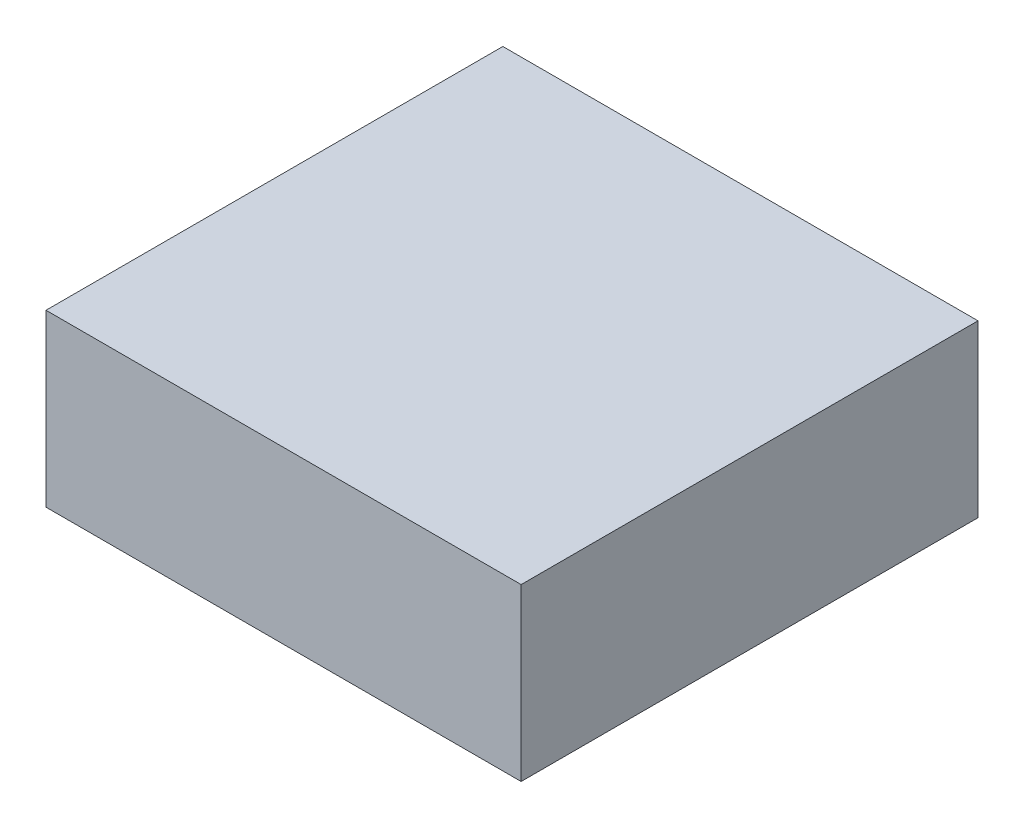
ISO-10303-21;
HEADER;
FILE_DESCRIPTION(('STEP AP214'),'2;1');
FILE_NAME('part.step','',(''),(''),'','','');
FILE_SCHEMA(('AUTOMOTIVE_DESIGN { 1 0 10303 214 1 1 1 1 }'));
ENDSEC;
DATA;
#1=APPLICATION_CONTEXT('core data for automotive mechanical design processes');
#2=APPLICATION_PROTOCOL_DEFINITION('international standard','automotive_design',2000,#1);
#3=PRODUCT_CONTEXT('',#1,'mechanical');
#4=PRODUCT('Part','Part','',(#3));
#5=PRODUCT_RELATED_PRODUCT_CATEGORY('part','',(#4));
#6=PRODUCT_DEFINITION_FORMATION('','',#4);
#7=PRODUCT_DEFINITION_CONTEXT('part definition',#1,'design');
#8=PRODUCT_DEFINITION('design','',#6,#7);
#9=PRODUCT_DEFINITION_SHAPE('','',#8);
#10=(LENGTH_UNIT() NAMED_UNIT(*) SI_UNIT(.MILLI.,.METRE.));
#11=(NAMED_UNIT(*) PLANE_ANGLE_UNIT() SI_UNIT($,.RADIAN.));
#12=(NAMED_UNIT(*) SI_UNIT($,.STERADIAN.) SOLID_ANGLE_UNIT());
#13=UNCERTAINTY_MEASURE_WITH_UNIT(LENGTH_MEASURE(1.E-05),#10,'distance_accuracy_value','');
#14=(GEOMETRIC_REPRESENTATION_CONTEXT(3) GLOBAL_UNCERTAINTY_ASSIGNED_CONTEXT((#13)) GLOBAL_UNIT_ASSIGNED_CONTEXT((#10,
#11,#12)) REPRESENTATION_CONTEXT('',''));
#15=CARTESIAN_POINT('',(0.,0.,0.));
#16=DIRECTION('',(0.,0.,1.));
#17=DIRECTION('',(1.,0.,0.));
#18=AXIS2_PLACEMENT_3D('',#15,#16,#17);
#19=CARTESIAN_POINT('',(0.,28.,-75.));
#20=DIRECTION('',(0.,0.,-1.));
#21=DIRECTION('',(-1.,0.,0.));
#22=AXIS2_PLACEMENT_3D('',#19,#20,#21);
#23=PLANE('',#22);
#24=DIRECTION('',(1.,0.,0.));
#25=VECTOR('',#24,1.);
#26=CARTESIAN_POINT('',(0.,0.,-75.));
#27=LINE('',#26,#25);
#28=CARTESIAN_POINT('',(0.,0.,-75.));
#29=VERTEX_POINT('',#28);
#30=CARTESIAN_POINT('',(78.,0.,-75.));
#31=VERTEX_POINT('',#30);
#32=EDGE_CURVE('E99',#29,#31,#27,.T.);
#33=ORIENTED_EDGE('',*,*,#32,.F.);
#34=DIRECTION('',(0.,-1.,0.));
#35=VECTOR('',#34,1.);
#36=CARTESIAN_POINT('',(0.,28.,-75.));
#37=LINE('',#36,#35);
#38=CARTESIAN_POINT('',(0.,28.,-75.));
#39=VERTEX_POINT('',#38);
#40=EDGE_CURVE('E11',#39,#29,#37,.T.);
#41=ORIENTED_EDGE('',*,*,#40,.F.);
#42=DIRECTION('',(1.,0.,0.));
#43=VECTOR('',#42,1.);
#44=CARTESIAN_POINT('',(0.,28.,-75.));
#45=LINE('',#44,#43);
#46=CARTESIAN_POINT('',(78.,28.,-75.));
#47=VERTEX_POINT('',#46);
#48=EDGE_CURVE('E93',#39,#47,#45,.T.);
#49=ORIENTED_EDGE('',*,*,#48,.T.);
#50=DIRECTION('',(0.,-1.,0.));
#51=VECTOR('',#50,1.);
#52=CARTESIAN_POINT('',(78.,28.,-75.));
#53=LINE('',#52,#51);
#54=EDGE_CURVE('E38',#47,#31,#53,.T.);
#55=ORIENTED_EDGE('',*,*,#54,.T.);
#56=EDGE_LOOP('',(#33,#41,#49,#55));
#57=FACE_BOUND('',#56,.T.);
#58=ADVANCED_FACE('F35',(#57),#23,.T.);
#59=CARTESIAN_POINT('',(0.,28.,0.));
#60=DIRECTION('',(-1.,0.,0.));
#61=DIRECTION('',(0.,0.,1.));
#62=AXIS2_PLACEMENT_3D('',#59,#60,#61);
#63=PLANE('',#62);
#64=DIRECTION('',(0.,0.,-1.));
#65=VECTOR('',#64,1.);
#66=CARTESIAN_POINT('',(0.,0.,0.));
#67=LINE('',#66,#65);
#68=CARTESIAN_POINT('',(0.,0.,0.));
#69=VERTEX_POINT('',#68);
#70=EDGE_CURVE('E95',#69,#29,#67,.T.);
#71=ORIENTED_EDGE('',*,*,#70,.F.);
#72=DIRECTION('',(0.,-1.,0.));
#73=VECTOR('',#72,1.);
#74=CARTESIAN_POINT('',(0.,28.,0.));
#75=LINE('',#74,#73);
#76=CARTESIAN_POINT('',(0.,28.,0.));
#77=VERTEX_POINT('',#76);
#78=EDGE_CURVE('E44',#77,#69,#75,.T.);
#79=ORIENTED_EDGE('',*,*,#78,.F.);
#80=DIRECTION('',(0.,0.,-1.));
#81=VECTOR('',#80,1.);
#82=CARTESIAN_POINT('',(0.,28.,0.));
#83=LINE('',#82,#81);
#84=EDGE_CURVE('E83',#77,#39,#83,.T.);
#85=ORIENTED_EDGE('',*,*,#84,.T.);
#86=ORIENTED_EDGE('',*,*,#40,.T.);
#87=EDGE_LOOP('',(#71,#79,#85,#86));
#88=FACE_BOUND('',#87,.T.);
#89=ADVANCED_FACE('F109',(#88),#63,.T.);
#90=CARTESIAN_POINT('',(0.,28.,0.));
#91=DIRECTION('',(0.,0.,-1.));
#92=DIRECTION('',(-1.,0.,0.));
#93=AXIS2_PLACEMENT_3D('',#90,#91,#92);
#94=PLANE('',#93);
#95=DIRECTION('',(1.,0.,0.));
#96=VECTOR('',#95,1.);
#97=CARTESIAN_POINT('',(0.,0.,0.));
#98=LINE('',#97,#96);
#99=CARTESIAN_POINT('',(78.,0.,0.));
#100=VERTEX_POINT('',#99);
#101=EDGE_CURVE('E88',#69,#100,#98,.T.);
#102=ORIENTED_EDGE('',*,*,#101,.T.);
#103=DIRECTION('',(0.,-1.,0.));
#104=VECTOR('',#103,1.);
#105=CARTESIAN_POINT('',(78.,28.,0.));
#106=LINE('',#105,#104);
#107=CARTESIAN_POINT('',(78.,28.,0.));
#108=VERTEX_POINT('',#107);
#109=EDGE_CURVE('E86',#108,#100,#106,.T.);
#110=ORIENTED_EDGE('',*,*,#109,.F.);
#111=DIRECTION('',(1.,0.,0.));
#112=VECTOR('',#111,1.);
#113=CARTESIAN_POINT('',(0.,28.,0.));
#114=LINE('',#113,#112);
#115=EDGE_CURVE('E80',#77,#108,#114,.T.);
#116=ORIENTED_EDGE('',*,*,#115,.F.);
#117=ORIENTED_EDGE('',*,*,#78,.T.);
#118=EDGE_LOOP('',(#102,#110,#116,#117));
#119=FACE_BOUND('',#118,.T.);
#120=ADVANCED_FACE('F87',(#119),#94,.F.);
#121=CARTESIAN_POINT('',(78.,28.,0.));
#122=DIRECTION('',(-1.,0.,0.));
#123=DIRECTION('',(0.,0.,1.));
#124=AXIS2_PLACEMENT_3D('',#121,#122,#123);
#125=PLANE('',#124);
#126=DIRECTION('',(0.,0.,-1.));
#127=VECTOR('',#126,1.);
#128=CARTESIAN_POINT('',(78.,0.,0.));
#129=LINE('',#128,#127);
#130=EDGE_CURVE('E102',#100,#31,#129,.T.);
#131=ORIENTED_EDGE('',*,*,#130,.T.);
#132=ORIENTED_EDGE('',*,*,#54,.F.);
#133=DIRECTION('',(0.,0.,-1.));
#134=VECTOR('',#133,1.);
#135=CARTESIAN_POINT('',(78.,28.,0.));
#136=LINE('',#135,#134);
#137=EDGE_CURVE('E77',#108,#47,#136,.T.);
#138=ORIENTED_EDGE('',*,*,#137,.F.);
#139=ORIENTED_EDGE('',*,*,#109,.T.);
#140=EDGE_LOOP('',(#131,#132,#138,#139));
#141=FACE_BOUND('',#140,.T.);
#142=ADVANCED_FACE('F92',(#141),#125,.F.);
#143=CARTESIAN_POINT('',(0.,28.,0.));
#144=DIRECTION('',(0.,1.,0.));
#145=DIRECTION('',(0.,0.,1.));
#146=AXIS2_PLACEMENT_3D('',#143,#144,#145);
#147=PLANE('',#146);
#148=ORIENTED_EDGE('',*,*,#48,.F.);
#149=ORIENTED_EDGE('',*,*,#84,.F.);
#150=ORIENTED_EDGE('',*,*,#115,.T.);
#151=ORIENTED_EDGE('',*,*,#137,.T.);
#152=EDGE_LOOP('',(#148,#149,#150,#151));
#153=FACE_BOUND('',#152,.T.);
#154=ADVANCED_FACE('F82',(#153),#147,.T.);
#155=CARTESIAN_POINT('',(0.,0.,0.));
#156=DIRECTION('',(0.,1.,0.));
#157=DIRECTION('',(0.,0.,1.));
#158=AXIS2_PLACEMENT_3D('',#155,#156,#157);
#159=PLANE('',#158);
#160=ORIENTED_EDGE('',*,*,#32,.T.);
#161=ORIENTED_EDGE('',*,*,#130,.F.);
#162=ORIENTED_EDGE('',*,*,#101,.F.);
#163=ORIENTED_EDGE('',*,*,#70,.T.);
#164=EDGE_LOOP('',(#160,#161,#162,#163));
#165=FACE_BOUND('',#164,.T.);
#166=ADVANCED_FACE('F108',(#165),#159,.F.);
#167=CLOSED_SHELL('',(#58,#89,#120,#142,#154,#166));
#168=MANIFOLD_SOLID_BREP('B2',#167);
#169=ADVANCED_BREP_SHAPE_REPRESENTATION('',(#18,#168),#14);
#170=SHAPE_DEFINITION_REPRESENTATION(#9,#169);
ENDSEC;
END-ISO-10303-21;
